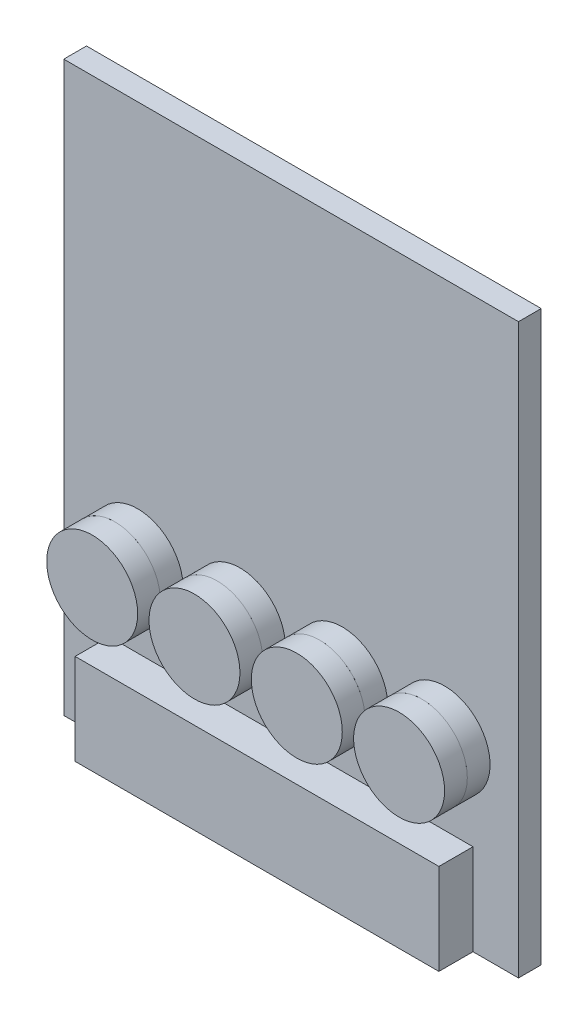
ISO-10303-21;
HEADER;
FILE_DESCRIPTION(('STEP AP214'),'2;1');
FILE_NAME('part.step','',(''),(''),'','','');
FILE_SCHEMA(('AUTOMOTIVE_DESIGN { 1 0 10303 214 1 1 1 1 }'));
ENDSEC;
DATA;
#1=APPLICATION_CONTEXT('core data for automotive mechanical design processes');
#2=APPLICATION_PROTOCOL_DEFINITION('international standard','automotive_design',2000,#1);
#3=PRODUCT_CONTEXT('',#1,'mechanical');
#4=PRODUCT('Part','Part','',(#3));
#5=PRODUCT_RELATED_PRODUCT_CATEGORY('part','',(#4));
#6=PRODUCT_DEFINITION_FORMATION('','',#4);
#7=PRODUCT_DEFINITION_CONTEXT('part definition',#1,'design');
#8=PRODUCT_DEFINITION('design','',#6,#7);
#9=PRODUCT_DEFINITION_SHAPE('','',#8);
#10=(LENGTH_UNIT() NAMED_UNIT(*) SI_UNIT(.MILLI.,.METRE.));
#11=(NAMED_UNIT(*) PLANE_ANGLE_UNIT() SI_UNIT($,.RADIAN.));
#12=(NAMED_UNIT(*) SI_UNIT($,.STERADIAN.) SOLID_ANGLE_UNIT());
#13=UNCERTAINTY_MEASURE_WITH_UNIT(LENGTH_MEASURE(1.E-05),#10,'distance_accuracy_value','');
#14=(GEOMETRIC_REPRESENTATION_CONTEXT(3) GLOBAL_UNCERTAINTY_ASSIGNED_CONTEXT((#13)) GLOBAL_UNIT_ASSIGNED_CONTEXT((#10,
#11,#12)) REPRESENTATION_CONTEXT('',''));
#15=CARTESIAN_POINT('',(0.,0.,0.));
#16=DIRECTION('',(0.,0.,1.));
#17=DIRECTION('',(1.,0.,0.));
#18=AXIS2_PLACEMENT_3D('',#15,#16,#17);
#19=CARTESIAN_POINT('',(33.5,15.,6.));
#20=DIRECTION('',(0.,0.,-1.));
#21=DIRECTION('',(-1.,0.,0.));
#22=AXIS2_PLACEMENT_3D('',#19,#20,#21);
#23=CYLINDRICAL_SURFACE('',#22,4.00000000000001);
#24=CARTESIAN_POINT('',(33.5,15.,6.));
#25=DIRECTION('',(0.,0.,1.));
#26=DIRECTION('',(1.,0.,0.));
#27=AXIS2_PLACEMENT_3D('',#24,#25,#26);
#28=CIRCLE('',#27,4.00000000000001);
#29=CARTESIAN_POINT('',(37.5,15.,6.));
#30=VERTEX_POINT('',#29);
#31=EDGE_CURVE('E11',#30,#30,#28,.T.);
#32=ORIENTED_EDGE('',*,*,#31,.F.);
#33=EDGE_LOOP('',(#32));
#34=FACE_BOUND('',#33,.T.);
#35=CARTESIAN_POINT('',(33.5,15.,4.));
#36=DIRECTION('',(0.,0.,1.));
#37=DIRECTION('',(1.,0.,0.));
#38=AXIS2_PLACEMENT_3D('',#35,#36,#37);
#39=CIRCLE('',#38,4.00000000000001);
#40=CARTESIAN_POINT('',(37.5,15.,4.));
#41=VERTEX_POINT('',#40);
#42=EDGE_CURVE('E47',#41,#41,#39,.T.);
#43=ORIENTED_EDGE('',*,*,#42,.T.);
#44=EDGE_LOOP('',(#43));
#45=FACE_BOUND('',#44,.T.);
#46=ADVANCED_FACE('F44',(#34,#45),#23,.T.);
#47=CARTESIAN_POINT('',(33.5,15.,6.));
#48=DIRECTION('',(0.,0.,1.));
#49=DIRECTION('',(1.,0.,0.));
#50=AXIS2_PLACEMENT_3D('',#47,#48,#49);
#51=PLANE('',#50);
#52=ORIENTED_EDGE('',*,*,#31,.T.);
#53=EDGE_LOOP('',(#52));
#54=FACE_BOUND('',#53,.T.);
#55=ADVANCED_FACE('F59',(#54),#51,.T.);
#56=CARTESIAN_POINT('',(33.5,15.,4.));
#57=DIRECTION('',(0.,0.,1.));
#58=DIRECTION('',(1.,0.,0.));
#59=AXIS2_PLACEMENT_3D('',#56,#57,#58);
#60=PLANE('',#59);
#61=ORIENTED_EDGE('',*,*,#42,.F.);
#62=EDGE_LOOP('',(#61));
#63=FACE_BOUND('',#62,.T.);
#64=ADVANCED_FACE('F57',(#63),#60,.F.);
#65=CLOSED_SHELL('',(#46,#55,#64));
#66=MANIFOLD_SOLID_BREP('B2',#65);
#67=CARTESIAN_POINT('',(24.5,15.,6.));
#68=DIRECTION('',(0.,0.,-1.));
#69=DIRECTION('',(-1.,0.,0.));
#70=AXIS2_PLACEMENT_3D('',#67,#68,#69);
#71=CYLINDRICAL_SURFACE('',#70,4.);
#72=CARTESIAN_POINT('',(24.5,15.,6.));
#73=DIRECTION('',(0.,0.,1.));
#74=DIRECTION('',(1.,0.,0.));
#75=AXIS2_PLACEMENT_3D('',#72,#73,#74);
#76=CIRCLE('',#75,4.);
#77=CARTESIAN_POINT('',(28.5,15.,6.));
#78=VERTEX_POINT('',#77);
#79=EDGE_CURVE('E43',#78,#78,#76,.T.);
#80=ORIENTED_EDGE('',*,*,#79,.F.);
#81=EDGE_LOOP('',(#80));
#82=FACE_BOUND('',#81,.T.);
#83=CARTESIAN_POINT('',(24.5,15.,4.));
#84=DIRECTION('',(0.,0.,1.));
#85=DIRECTION('',(1.,0.,0.));
#86=AXIS2_PLACEMENT_3D('',#83,#84,#85);
#87=CIRCLE('',#86,4.);
#88=CARTESIAN_POINT('',(28.5,15.,4.));
#89=VERTEX_POINT('',#88);
#90=EDGE_CURVE('E96',#89,#89,#87,.T.);
#91=ORIENTED_EDGE('',*,*,#90,.T.);
#92=EDGE_LOOP('',(#91));
#93=FACE_BOUND('',#92,.T.);
#94=ADVANCED_FACE('F93',(#82,#93),#71,.T.);
#95=CARTESIAN_POINT('',(24.5,15.,6.));
#96=DIRECTION('',(0.,0.,1.));
#97=DIRECTION('',(1.,0.,0.));
#98=AXIS2_PLACEMENT_3D('',#95,#96,#97);
#99=PLANE('',#98);
#100=ORIENTED_EDGE('',*,*,#79,.T.);
#101=EDGE_LOOP('',(#100));
#102=FACE_BOUND('',#101,.T.);
#103=ADVANCED_FACE('F108',(#102),#99,.T.);
#104=CARTESIAN_POINT('',(24.5,15.,4.));
#105=DIRECTION('',(0.,0.,1.));
#106=DIRECTION('',(1.,0.,0.));
#107=AXIS2_PLACEMENT_3D('',#104,#105,#106);
#108=PLANE('',#107);
#109=ORIENTED_EDGE('',*,*,#90,.F.);
#110=EDGE_LOOP('',(#109));
#111=FACE_BOUND('',#110,.T.);
#112=ADVANCED_FACE('F106',(#111),#108,.F.);
#113=CLOSED_SHELL('',(#94,#103,#112));
#114=MANIFOLD_SOLID_BREP('B6',#113);
#115=CARTESIAN_POINT('',(15.5,15.,6.));
#116=DIRECTION('',(0.,0.,-1.));
#117=DIRECTION('',(-1.,0.,0.));
#118=AXIS2_PLACEMENT_3D('',#115,#116,#117);
#119=CYLINDRICAL_SURFACE('',#118,3.99999999999999);
#120=CARTESIAN_POINT('',(15.5,15.,6.));
#121=DIRECTION('',(0.,0.,1.));
#122=DIRECTION('',(1.,0.,0.));
#123=AXIS2_PLACEMENT_3D('',#120,#121,#122);
#124=CIRCLE('',#123,3.99999999999999);
#125=CARTESIAN_POINT('',(19.5,15.,6.));
#126=VERTEX_POINT('',#125);
#127=EDGE_CURVE('E92',#126,#126,#124,.T.);
#128=ORIENTED_EDGE('',*,*,#127,.F.);
#129=EDGE_LOOP('',(#128));
#130=FACE_BOUND('',#129,.T.);
#131=CARTESIAN_POINT('',(15.5,15.,4.));
#132=DIRECTION('',(0.,0.,1.));
#133=DIRECTION('',(1.,0.,0.));
#134=AXIS2_PLACEMENT_3D('',#131,#132,#133);
#135=CIRCLE('',#134,3.99999999999999);
#136=CARTESIAN_POINT('',(19.5,15.,4.));
#137=VERTEX_POINT('',#136);
#138=EDGE_CURVE('E145',#137,#137,#135,.T.);
#139=ORIENTED_EDGE('',*,*,#138,.T.);
#140=EDGE_LOOP('',(#139));
#141=FACE_BOUND('',#140,.T.);
#142=ADVANCED_FACE('F142',(#130,#141),#119,.T.);
#143=CARTESIAN_POINT('',(15.5,15.,6.));
#144=DIRECTION('',(0.,0.,1.));
#145=DIRECTION('',(1.,0.,0.));
#146=AXIS2_PLACEMENT_3D('',#143,#144,#145);
#147=PLANE('',#146);
#148=ORIENTED_EDGE('',*,*,#127,.T.);
#149=EDGE_LOOP('',(#148));
#150=FACE_BOUND('',#149,.T.);
#151=ADVANCED_FACE('F157',(#150),#147,.T.);
#152=CARTESIAN_POINT('',(15.5,15.,4.));
#153=DIRECTION('',(0.,0.,1.));
#154=DIRECTION('',(1.,0.,0.));
#155=AXIS2_PLACEMENT_3D('',#152,#153,#154);
#156=PLANE('',#155);
#157=ORIENTED_EDGE('',*,*,#138,.F.);
#158=EDGE_LOOP('',(#157));
#159=FACE_BOUND('',#158,.T.);
#160=ADVANCED_FACE('F155',(#159),#156,.F.);
#161=CLOSED_SHELL('',(#142,#151,#160));
#162=MANIFOLD_SOLID_BREP('B38',#161);
#163=CARTESIAN_POINT('',(6.5,15.,6.));
#164=DIRECTION('',(0.,0.,-1.));
#165=DIRECTION('',(-1.,0.,0.));
#166=AXIS2_PLACEMENT_3D('',#163,#164,#165);
#167=CYLINDRICAL_SURFACE('',#166,4.);
#168=CARTESIAN_POINT('',(6.5,15.,6.));
#169=DIRECTION('',(0.,0.,1.));
#170=DIRECTION('',(1.,0.,0.));
#171=AXIS2_PLACEMENT_3D('',#168,#169,#170);
#172=CIRCLE('',#171,4.);
#173=CARTESIAN_POINT('',(10.5,15.,6.));
#174=VERTEX_POINT('',#173);
#175=EDGE_CURVE('E141',#174,#174,#172,.T.);
#176=ORIENTED_EDGE('',*,*,#175,.F.);
#177=EDGE_LOOP('',(#176));
#178=FACE_BOUND('',#177,.T.);
#179=CARTESIAN_POINT('',(6.5,15.,4.));
#180=DIRECTION('',(0.,0.,1.));
#181=DIRECTION('',(1.,0.,0.));
#182=AXIS2_PLACEMENT_3D('',#179,#180,#181);
#183=CIRCLE('',#182,4.);
#184=CARTESIAN_POINT('',(10.5,15.,4.));
#185=VERTEX_POINT('',#184);
#186=EDGE_CURVE('E195',#185,#185,#183,.T.);
#187=ORIENTED_EDGE('',*,*,#186,.T.);
#188=EDGE_LOOP('',(#187));
#189=FACE_BOUND('',#188,.T.);
#190=ADVANCED_FACE('F192',(#178,#189),#167,.T.);
#191=CARTESIAN_POINT('',(6.5,15.,6.));
#192=DIRECTION('',(0.,0.,1.));
#193=DIRECTION('',(1.,0.,0.));
#194=AXIS2_PLACEMENT_3D('',#191,#192,#193);
#195=PLANE('',#194);
#196=ORIENTED_EDGE('',*,*,#175,.T.);
#197=EDGE_LOOP('',(#196));
#198=FACE_BOUND('',#197,.T.);
#199=ADVANCED_FACE('F207',(#198),#195,.T.);
#200=CARTESIAN_POINT('',(6.5,15.,4.));
#201=DIRECTION('',(0.,0.,1.));
#202=DIRECTION('',(1.,0.,0.));
#203=AXIS2_PLACEMENT_3D('',#200,#201,#202);
#204=PLANE('',#203);
#205=ORIENTED_EDGE('',*,*,#186,.F.);
#206=EDGE_LOOP('',(#205));
#207=FACE_BOUND('',#206,.T.);
#208=ADVANCED_FACE('F205',(#207),#204,.F.);
#209=CLOSED_SHELL('',(#190,#199,#208));
#210=MANIFOLD_SOLID_BREP('B87',#209);
#211=CARTESIAN_POINT('',(0.,0.,2.));
#212=DIRECTION('',(0.,0.,-1.));
#213=DIRECTION('',(-1.,0.,0.));
#214=AXIS2_PLACEMENT_3D('',#211,#212,#213);
#215=PLANE('',#214);
#216=CARTESIAN_POINT('',(6.5,15.,2.));
#217=DIRECTION('',(0.,0.,-1.));
#218=DIRECTION('',(-1.,0.,0.));
#219=AXIS2_PLACEMENT_3D('',#216,#217,#218);
#220=CIRCLE('',#219,4.);
#221=CARTESIAN_POINT('',(2.5,15.,2.));
#222=VERTEX_POINT('',#221);
#223=EDGE_CURVE('E367',#222,#222,#220,.F.);
#224=ORIENTED_EDGE('',*,*,#223,.F.);
#225=EDGE_LOOP('',(#224));
#226=FACE_BOUND('',#225,.T.);
#227=CARTESIAN_POINT('',(15.5,15.,2.));
#228=DIRECTION('',(0.,0.,-1.));
#229=DIRECTION('',(-1.,0.,0.));
#230=AXIS2_PLACEMENT_3D('',#227,#228,#229);
#231=CIRCLE('',#230,3.99999999999999);
#232=CARTESIAN_POINT('',(11.5,15.,2.));
#233=VERTEX_POINT('',#232);
#234=EDGE_CURVE('E370',#233,#233,#231,.F.);
#235=ORIENTED_EDGE('',*,*,#234,.F.);
#236=EDGE_LOOP('',(#235));
#237=FACE_BOUND('',#236,.T.);
#238=CARTESIAN_POINT('',(24.5,15.,2.));
#239=DIRECTION('',(0.,0.,-1.));
#240=DIRECTION('',(-1.,0.,0.));
#241=AXIS2_PLACEMENT_3D('',#238,#239,#240);
#242=CIRCLE('',#241,4.);
#243=CARTESIAN_POINT('',(20.5,15.,2.));
#244=VERTEX_POINT('',#243);
#245=EDGE_CURVE('E241',#244,#244,#242,.F.);
#246=ORIENTED_EDGE('',*,*,#245,.F.);
#247=EDGE_LOOP('',(#246));
#248=FACE_BOUND('',#247,.T.);
#249=CARTESIAN_POINT('',(33.5,15.,2.));
#250=DIRECTION('',(0.,0.,-1.));
#251=DIRECTION('',(-1.,0.,0.));
#252=AXIS2_PLACEMENT_3D('',#249,#250,#251);
#253=CIRCLE('',#252,4.00000000000001);
#254=CARTESIAN_POINT('',(29.5,15.,2.));
#255=VERTEX_POINT('',#254);
#256=EDGE_CURVE('E190',#255,#255,#253,.F.);
#257=ORIENTED_EDGE('',*,*,#256,.F.);
#258=EDGE_LOOP('',(#257));
#259=FACE_BOUND('',#258,.T.);
#260=DIRECTION('',(0.,-1.,0.));
#261=VECTOR('',#260,1.);
#262=CARTESIAN_POINT('',(3.99999999999999,8.,2.));
#263=LINE('',#262,#261);
#264=CARTESIAN_POINT('',(3.99999999999999,8.,2.));
#265=VERTEX_POINT('',#264);
#266=CARTESIAN_POINT('',(3.99999999999999,0.,2.));
#267=VERTEX_POINT('',#266);
#268=EDGE_CURVE('E318',#265,#267,#263,.T.);
#269=ORIENTED_EDGE('',*,*,#268,.F.);
#270=DIRECTION('',(-1.,0.,0.));
#271=VECTOR('',#270,1.);
#272=CARTESIAN_POINT('',(3.99999999999999,8.,2.));
#273=LINE('',#272,#271);
#274=CARTESIAN_POINT('',(36.,8.,2.));
#275=VERTEX_POINT('',#274);
#276=EDGE_CURVE('E248',#275,#265,#273,.T.);
#277=ORIENTED_EDGE('',*,*,#276,.F.);
#278=DIRECTION('',(0.,1.,0.));
#279=VECTOR('',#278,1.);
#280=CARTESIAN_POINT('',(36.,8.,2.));
#281=LINE('',#280,#279);
#282=CARTESIAN_POINT('',(36.,0.,2.));
#283=VERTEX_POINT('',#282);
#284=EDGE_CURVE('E252',#283,#275,#281,.T.);
#285=ORIENTED_EDGE('',*,*,#284,.F.);
#286=DIRECTION('',(1.,0.,0.));
#287=VECTOR('',#286,1.);
#288=CARTESIAN_POINT('',(0.,0.,2.));
#289=LINE('',#288,#287);
#290=CARTESIAN_POINT('',(40.,0.,2.));
#291=VERTEX_POINT('',#290);
#292=EDGE_CURVE('E340',#283,#291,#289,.T.);
#293=ORIENTED_EDGE('',*,*,#292,.T.);
#294=DIRECTION('',(0.,1.,0.));
#295=VECTOR('',#294,1.);
#296=CARTESIAN_POINT('',(40.,0.,2.));
#297=LINE('',#296,#295);
#298=CARTESIAN_POINT('',(40.,50.,2.));
#299=VERTEX_POINT('',#298);
#300=EDGE_CURVE('E344',#291,#299,#297,.T.);
#301=ORIENTED_EDGE('',*,*,#300,.T.);
#302=DIRECTION('',(-1.,0.,0.));
#303=VECTOR('',#302,1.);
#304=CARTESIAN_POINT('',(0.,50.,2.));
#305=LINE('',#304,#303);
#306=CARTESIAN_POINT('',(0.,50.,2.));
#307=VERTEX_POINT('',#306);
#308=EDGE_CURVE('E346',#299,#307,#305,.T.);
#309=ORIENTED_EDGE('',*,*,#308,.T.);
#310=DIRECTION('',(0.,-1.,0.));
#311=VECTOR('',#310,1.);
#312=CARTESIAN_POINT('',(0.,0.,2.));
#313=LINE('',#312,#311);
#314=CARTESIAN_POINT('',(0.,0.,2.));
#315=VERTEX_POINT('',#314);
#316=EDGE_CURVE('E337',#307,#315,#313,.T.);
#317=ORIENTED_EDGE('',*,*,#316,.T.);
#318=EDGE_CURVE('E342',#315,#267,#289,.T.);
#319=ORIENTED_EDGE('',*,*,#318,.T.);
#320=EDGE_LOOP('',(#269,#277,#285,#293,#301,#309,#317,#319));
#321=FACE_BOUND('',#320,.T.);
#322=ADVANCED_FACE('F233',(#226,#237,#248,#259,#321),#215,.F.);
#323=CARTESIAN_POINT('',(0.,0.,2.));
#324=DIRECTION('',(1.,0.,0.));
#325=DIRECTION('',(0.,0.,-1.));
#326=AXIS2_PLACEMENT_3D('',#323,#324,#325);
#327=PLANE('',#326);
#328=DIRECTION('',(0.,-1.,0.));
#329=VECTOR('',#328,1.);
#330=CARTESIAN_POINT('',(0.,0.,0.));
#331=LINE('',#330,#329);
#332=CARTESIAN_POINT('',(0.,50.,0.));
#333=VERTEX_POINT('',#332);
#334=CARTESIAN_POINT('',(0.,0.,0.));
#335=VERTEX_POINT('',#334);
#336=EDGE_CURVE('E336',#333,#335,#331,.T.);
#337=ORIENTED_EDGE('',*,*,#336,.T.);
#338=DIRECTION('',(0.,0.,-1.));
#339=VECTOR('',#338,1.);
#340=CARTESIAN_POINT('',(0.,0.,2.));
#341=LINE('',#340,#339);
#342=EDGE_CURVE('E364',#315,#335,#341,.T.);
#343=ORIENTED_EDGE('',*,*,#342,.F.);
#344=ORIENTED_EDGE('',*,*,#316,.F.);
#345=DIRECTION('',(0.,0.,-1.));
#346=VECTOR('',#345,1.);
#347=CARTESIAN_POINT('',(0.,50.,2.));
#348=LINE('',#347,#346);
#349=EDGE_CURVE('E348',#307,#333,#348,.T.);
#350=ORIENTED_EDGE('',*,*,#349,.T.);
#351=EDGE_LOOP('',(#337,#343,#344,#350));
#352=FACE_BOUND('',#351,.T.);
#353=ADVANCED_FACE('F235',(#352),#327,.F.);
#354=CARTESIAN_POINT('',(0.,0.,2.));
#355=DIRECTION('',(0.,1.,0.));
#356=DIRECTION('',(0.,0.,1.));
#357=AXIS2_PLACEMENT_3D('',#354,#355,#356);
#358=PLANE('',#357);
#359=DIRECTION('',(1.,0.,0.));
#360=VECTOR('',#359,1.);
#361=CARTESIAN_POINT('',(0.,0.,0.));
#362=LINE('',#361,#360);
#363=CARTESIAN_POINT('',(40.,0.,0.));
#364=VERTEX_POINT('',#363);
#365=EDGE_CURVE('E351',#335,#364,#362,.T.);
#366=ORIENTED_EDGE('',*,*,#365,.T.);
#367=DIRECTION('',(0.,0.,-1.));
#368=VECTOR('',#367,1.);
#369=CARTESIAN_POINT('',(40.,0.,2.));
#370=LINE('',#369,#368);
#371=EDGE_CURVE('E361',#291,#364,#370,.T.);
#372=ORIENTED_EDGE('',*,*,#371,.F.);
#373=ORIENTED_EDGE('',*,*,#292,.F.);
#374=DIRECTION('',(0.,0.,-1.));
#375=VECTOR('',#374,1.);
#376=CARTESIAN_POINT('',(36.,0.,5.));
#377=LINE('',#376,#375);
#378=CARTESIAN_POINT('',(36.,0.,5.));
#379=VERTEX_POINT('',#378);
#380=EDGE_CURVE('E303',#379,#283,#377,.T.);
#381=ORIENTED_EDGE('',*,*,#380,.F.);
#382=DIRECTION('',(1.,0.,0.));
#383=VECTOR('',#382,1.);
#384=CARTESIAN_POINT('',(3.99999999999999,0.,5.));
#385=LINE('',#384,#383);
#386=CARTESIAN_POINT('',(3.99999999999999,0.,5.));
#387=VERTEX_POINT('',#386);
#388=EDGE_CURVE('E296',#387,#379,#385,.T.);
#389=ORIENTED_EDGE('',*,*,#388,.F.);
#390=DIRECTION('',(0.,0.,-1.));
#391=VECTOR('',#390,1.);
#392=CARTESIAN_POINT('',(3.99999999999999,0.,5.));
#393=LINE('',#392,#391);
#394=EDGE_CURVE('E300',#387,#267,#393,.T.);
#395=ORIENTED_EDGE('',*,*,#394,.T.);
#396=ORIENTED_EDGE('',*,*,#318,.F.);
#397=ORIENTED_EDGE('',*,*,#342,.T.);
#398=EDGE_LOOP('',(#366,#372,#373,#381,#389,#395,#396,#397));
#399=FACE_BOUND('',#398,.T.);
#400=ADVANCED_FACE('F298',(#399),#358,.F.);
#401=CARTESIAN_POINT('',(40.,0.,2.));
#402=DIRECTION('',(-1.,0.,0.));
#403=DIRECTION('',(0.,0.,1.));
#404=AXIS2_PLACEMENT_3D('',#401,#402,#403);
#405=PLANE('',#404);
#406=DIRECTION('',(0.,1.,0.));
#407=VECTOR('',#406,1.);
#408=CARTESIAN_POINT('',(40.,0.,0.));
#409=LINE('',#408,#407);
#410=CARTESIAN_POINT('',(40.,50.,0.));
#411=VERTEX_POINT('',#410);
#412=EDGE_CURVE('E353',#364,#411,#409,.T.);
#413=ORIENTED_EDGE('',*,*,#412,.T.);
#414=DIRECTION('',(0.,0.,-1.));
#415=VECTOR('',#414,1.);
#416=CARTESIAN_POINT('',(40.,50.,2.));
#417=LINE('',#416,#415);
#418=EDGE_CURVE('E358',#299,#411,#417,.T.);
#419=ORIENTED_EDGE('',*,*,#418,.F.);
#420=ORIENTED_EDGE('',*,*,#300,.F.);
#421=ORIENTED_EDGE('',*,*,#371,.T.);
#422=EDGE_LOOP('',(#413,#419,#420,#421));
#423=FACE_BOUND('',#422,.T.);
#424=ADVANCED_FACE('F443',(#423),#405,.F.);
#425=CARTESIAN_POINT('',(0.,50.,2.));
#426=DIRECTION('',(0.,-1.,0.));
#427=DIRECTION('',(0.,0.,-1.));
#428=AXIS2_PLACEMENT_3D('',#425,#426,#427);
#429=PLANE('',#428);
#430=DIRECTION('',(-1.,0.,0.));
#431=VECTOR('',#430,1.);
#432=CARTESIAN_POINT('',(0.,50.,0.));
#433=LINE('',#432,#431);
#434=EDGE_CURVE('E341',#411,#333,#433,.T.);
#435=ORIENTED_EDGE('',*,*,#434,.T.);
#436=ORIENTED_EDGE('',*,*,#349,.F.);
#437=ORIENTED_EDGE('',*,*,#308,.F.);
#438=ORIENTED_EDGE('',*,*,#418,.T.);
#439=EDGE_LOOP('',(#435,#436,#437,#438));
#440=FACE_BOUND('',#439,.T.);
#441=ADVANCED_FACE('F439',(#440),#429,.F.);
#442=CARTESIAN_POINT('',(0.,0.,0.));
#443=DIRECTION('',(0.,0.,-1.));
#444=DIRECTION('',(-1.,0.,0.));
#445=AXIS2_PLACEMENT_3D('',#442,#443,#444);
#446=PLANE('',#445);
#447=ORIENTED_EDGE('',*,*,#336,.F.);
#448=ORIENTED_EDGE('',*,*,#434,.F.);
#449=ORIENTED_EDGE('',*,*,#412,.F.);
#450=ORIENTED_EDGE('',*,*,#365,.F.);
#451=EDGE_LOOP('',(#447,#448,#449,#450));
#452=FACE_BOUND('',#451,.T.);
#453=ADVANCED_FACE('F434',(#452),#446,.T.);
#454=CARTESIAN_POINT('',(6.5,15.,4.));
#455=DIRECTION('',(0.,0.,-1.));
#456=DIRECTION('',(-1.,0.,0.));
#457=AXIS2_PLACEMENT_3D('',#454,#455,#456);
#458=CYLINDRICAL_SURFACE('',#457,4.);
#459=CARTESIAN_POINT('',(6.5,15.,4.));
#460=DIRECTION('',(0.,0.,1.));
#461=DIRECTION('',(1.,0.,0.));
#462=AXIS2_PLACEMENT_3D('',#459,#460,#461);
#463=CIRCLE('',#462,4.);
#464=CARTESIAN_POINT('',(10.5,15.,4.));
#465=VERTEX_POINT('',#464);
#466=EDGE_CURVE('E333',#465,#465,#463,.T.);
#467=ORIENTED_EDGE('',*,*,#466,.F.);
#468=EDGE_LOOP('',(#467));
#469=FACE_BOUND('',#468,.T.);
#470=ORIENTED_EDGE('',*,*,#223,.T.);
#471=EDGE_LOOP('',(#470));
#472=FACE_BOUND('',#471,.T.);
#473=ADVANCED_FACE('F431',(#469,#472),#458,.T.);
#474=CARTESIAN_POINT('',(6.5,15.,4.));
#475=DIRECTION('',(0.,0.,1.));
#476=DIRECTION('',(1.,0.,0.));
#477=AXIS2_PLACEMENT_3D('',#474,#475,#476);
#478=PLANE('',#477);
#479=ORIENTED_EDGE('',*,*,#466,.T.);
#480=EDGE_LOOP('',(#479));
#481=FACE_BOUND('',#480,.T.);
#482=ADVANCED_FACE('F427',(#481),#478,.T.);
#483=CARTESIAN_POINT('',(15.5,15.,4.));
#484=DIRECTION('',(0.,0.,-1.));
#485=DIRECTION('',(-1.,0.,0.));
#486=AXIS2_PLACEMENT_3D('',#483,#484,#485);
#487=CYLINDRICAL_SURFACE('',#486,3.99999999999999);
#488=CARTESIAN_POINT('',(15.5,15.,4.));
#489=DIRECTION('',(0.,0.,1.));
#490=DIRECTION('',(1.,0.,0.));
#491=AXIS2_PLACEMENT_3D('',#488,#489,#490);
#492=CIRCLE('',#491,3.99999999999999);
#493=CARTESIAN_POINT('',(19.5,15.,4.));
#494=VERTEX_POINT('',#493);
#495=EDGE_CURVE('E330',#494,#494,#492,.T.);
#496=ORIENTED_EDGE('',*,*,#495,.F.);
#497=EDGE_LOOP('',(#496));
#498=FACE_BOUND('',#497,.T.);
#499=ORIENTED_EDGE('',*,*,#234,.T.);
#500=EDGE_LOOP('',(#499));
#501=FACE_BOUND('',#500,.T.);
#502=ADVANCED_FACE('F423',(#498,#501),#487,.T.);
#503=CARTESIAN_POINT('',(15.5,15.,4.));
#504=DIRECTION('',(0.,0.,1.));
#505=DIRECTION('',(1.,0.,0.));
#506=AXIS2_PLACEMENT_3D('',#503,#504,#505);
#507=PLANE('',#506);
#508=ORIENTED_EDGE('',*,*,#495,.T.);
#509=EDGE_LOOP('',(#508));
#510=FACE_BOUND('',#509,.T.);
#511=ADVANCED_FACE('F419',(#510),#507,.T.);
#512=CARTESIAN_POINT('',(24.5,15.,4.));
#513=DIRECTION('',(0.,0.,-1.));
#514=DIRECTION('',(-1.,0.,0.));
#515=AXIS2_PLACEMENT_3D('',#512,#513,#514);
#516=CYLINDRICAL_SURFACE('',#515,4.);
#517=CARTESIAN_POINT('',(24.5,15.,4.));
#518=DIRECTION('',(0.,0.,1.));
#519=DIRECTION('',(1.,0.,0.));
#520=AXIS2_PLACEMENT_3D('',#517,#518,#519);
#521=CIRCLE('',#520,4.);
#522=CARTESIAN_POINT('',(28.5,15.,4.));
#523=VERTEX_POINT('',#522);
#524=EDGE_CURVE('E322',#523,#523,#521,.T.);
#525=ORIENTED_EDGE('',*,*,#524,.F.);
#526=EDGE_LOOP('',(#525));
#527=FACE_BOUND('',#526,.T.);
#528=ORIENTED_EDGE('',*,*,#245,.T.);
#529=EDGE_LOOP('',(#528));
#530=FACE_BOUND('',#529,.T.);
#531=ADVANCED_FACE('F375',(#527,#530),#516,.T.);
#532=CARTESIAN_POINT('',(24.5,15.,4.));
#533=DIRECTION('',(0.,0.,1.));
#534=DIRECTION('',(1.,0.,0.));
#535=AXIS2_PLACEMENT_3D('',#532,#533,#534);
#536=PLANE('',#535);
#537=ORIENTED_EDGE('',*,*,#524,.T.);
#538=EDGE_LOOP('',(#537));
#539=FACE_BOUND('',#538,.T.);
#540=ADVANCED_FACE('F412',(#539),#536,.T.);
#541=CARTESIAN_POINT('',(33.5,15.,4.));
#542=DIRECTION('',(0.,0.,-1.));
#543=DIRECTION('',(-1.,0.,0.));
#544=AXIS2_PLACEMENT_3D('',#541,#542,#543);
#545=CYLINDRICAL_SURFACE('',#544,4.00000000000001);
#546=CARTESIAN_POINT('',(33.5,15.,4.));
#547=DIRECTION('',(0.,0.,1.));
#548=DIRECTION('',(1.,0.,0.));
#549=AXIS2_PLACEMENT_3D('',#546,#547,#548);
#550=CIRCLE('',#549,4.00000000000001);
#551=CARTESIAN_POINT('',(37.5,15.,4.));
#552=VERTEX_POINT('',#551);
#553=EDGE_CURVE('E319',#552,#552,#550,.T.);
#554=ORIENTED_EDGE('',*,*,#553,.F.);
#555=EDGE_LOOP('',(#554));
#556=FACE_BOUND('',#555,.T.);
#557=ORIENTED_EDGE('',*,*,#256,.T.);
#558=EDGE_LOOP('',(#557));
#559=FACE_BOUND('',#558,.T.);
#560=ADVANCED_FACE('F408',(#556,#559),#545,.T.);
#561=CARTESIAN_POINT('',(33.5,15.,4.));
#562=DIRECTION('',(0.,0.,1.));
#563=DIRECTION('',(1.,0.,0.));
#564=AXIS2_PLACEMENT_3D('',#561,#562,#563);
#565=PLANE('',#564);
#566=ORIENTED_EDGE('',*,*,#553,.T.);
#567=EDGE_LOOP('',(#566));
#568=FACE_BOUND('',#567,.T.);
#569=ADVANCED_FACE('F402',(#568),#565,.T.);
#570=CARTESIAN_POINT('',(3.99999999999999,8.,5.));
#571=DIRECTION('',(1.,0.,0.));
#572=DIRECTION('',(0.,1.,0.));
#573=AXIS2_PLACEMENT_3D('',#570,#571,#572);
#574=PLANE('',#573);
#575=ORIENTED_EDGE('',*,*,#268,.T.);
#576=ORIENTED_EDGE('',*,*,#394,.F.);
#577=DIRECTION('',(0.,-1.,0.));
#578=VECTOR('',#577,1.);
#579=CARTESIAN_POINT('',(3.99999999999999,8.,5.));
#580=LINE('',#579,#578);
#581=CARTESIAN_POINT('',(3.99999999999999,8.,5.));
#582=VERTEX_POINT('',#581);
#583=EDGE_CURVE('E307',#582,#387,#580,.T.);
#584=ORIENTED_EDGE('',*,*,#583,.F.);
#585=DIRECTION('',(0.,0.,-1.));
#586=VECTOR('',#585,1.);
#587=CARTESIAN_POINT('',(3.99999999999999,8.,5.));
#588=LINE('',#587,#586);
#589=EDGE_CURVE('E386',#582,#265,#588,.T.);
#590=ORIENTED_EDGE('',*,*,#589,.T.);
#591=EDGE_LOOP('',(#575,#576,#584,#590));
#592=FACE_BOUND('',#591,.T.);
#593=ADVANCED_FACE('F317',(#592),#574,.F.);
#594=CARTESIAN_POINT('',(36.,8.,5.));
#595=DIRECTION('',(-1.,0.,0.));
#596=DIRECTION('',(0.,0.,1.));
#597=AXIS2_PLACEMENT_3D('',#594,#595,#596);
#598=PLANE('',#597);
#599=ORIENTED_EDGE('',*,*,#284,.T.);
#600=DIRECTION('',(0.,0.,-1.));
#601=VECTOR('',#600,1.);
#602=CARTESIAN_POINT('',(36.,8.,5.));
#603=LINE('',#602,#601);
#604=CARTESIAN_POINT('',(36.,8.,5.));
#605=VERTEX_POINT('',#604);
#606=EDGE_CURVE('E324',#605,#275,#603,.T.);
#607=ORIENTED_EDGE('',*,*,#606,.F.);
#608=DIRECTION('',(0.,1.,0.));
#609=VECTOR('',#608,1.);
#610=CARTESIAN_POINT('',(36.,8.,5.));
#611=LINE('',#610,#609);
#612=EDGE_CURVE('E306',#379,#605,#611,.T.);
#613=ORIENTED_EDGE('',*,*,#612,.F.);
#614=ORIENTED_EDGE('',*,*,#380,.T.);
#615=EDGE_LOOP('',(#599,#607,#613,#614));
#616=FACE_BOUND('',#615,.T.);
#617=ADVANCED_FACE('F394',(#616),#598,.F.);
#618=CARTESIAN_POINT('',(3.99999999999999,8.,5.));
#619=DIRECTION('',(0.,-1.,0.));
#620=DIRECTION('',(1.,0.,0.));
#621=AXIS2_PLACEMENT_3D('',#618,#619,#620);
#622=PLANE('',#621);
#623=ORIENTED_EDGE('',*,*,#276,.T.);
#624=ORIENTED_EDGE('',*,*,#589,.F.);
#625=DIRECTION('',(-1.,0.,0.));
#626=VECTOR('',#625,1.);
#627=CARTESIAN_POINT('',(3.99999999999999,8.,5.));
#628=LINE('',#627,#626);
#629=EDGE_CURVE('E312',#605,#582,#628,.T.);
#630=ORIENTED_EDGE('',*,*,#629,.F.);
#631=ORIENTED_EDGE('',*,*,#606,.T.);
#632=EDGE_LOOP('',(#623,#624,#630,#631));
#633=FACE_BOUND('',#632,.T.);
#634=ADVANCED_FACE('F385',(#633),#622,.F.);
#635=CARTESIAN_POINT('',(0.,0.,5.));
#636=DIRECTION('',(0.,0.,1.));
#637=DIRECTION('',(1.,0.,0.));
#638=AXIS2_PLACEMENT_3D('',#635,#636,#637);
#639=PLANE('',#638);
#640=ORIENTED_EDGE('',*,*,#583,.T.);
#641=ORIENTED_EDGE('',*,*,#388,.T.);
#642=ORIENTED_EDGE('',*,*,#612,.T.);
#643=ORIENTED_EDGE('',*,*,#629,.T.);
#644=EDGE_LOOP('',(#640,#641,#642,#643));
#645=FACE_BOUND('',#644,.T.);
#646=ADVANCED_FACE('F310',(#645),#639,.T.);
#647=CLOSED_SHELL('',(#322,#353,#400,#424,#441,#453,#473,#482,#502,#511,#531,#540,#560,#569,
#593,#617,#634,#646));
#648=MANIFOLD_SOLID_BREP('B136',#647);
#649=ADVANCED_BREP_SHAPE_REPRESENTATION('',(#18,#66,#114,#162,#210,#648),#14);
#650=SHAPE_DEFINITION_REPRESENTATION(#9,#649);
ENDSEC;
END-ISO-10303-21;
